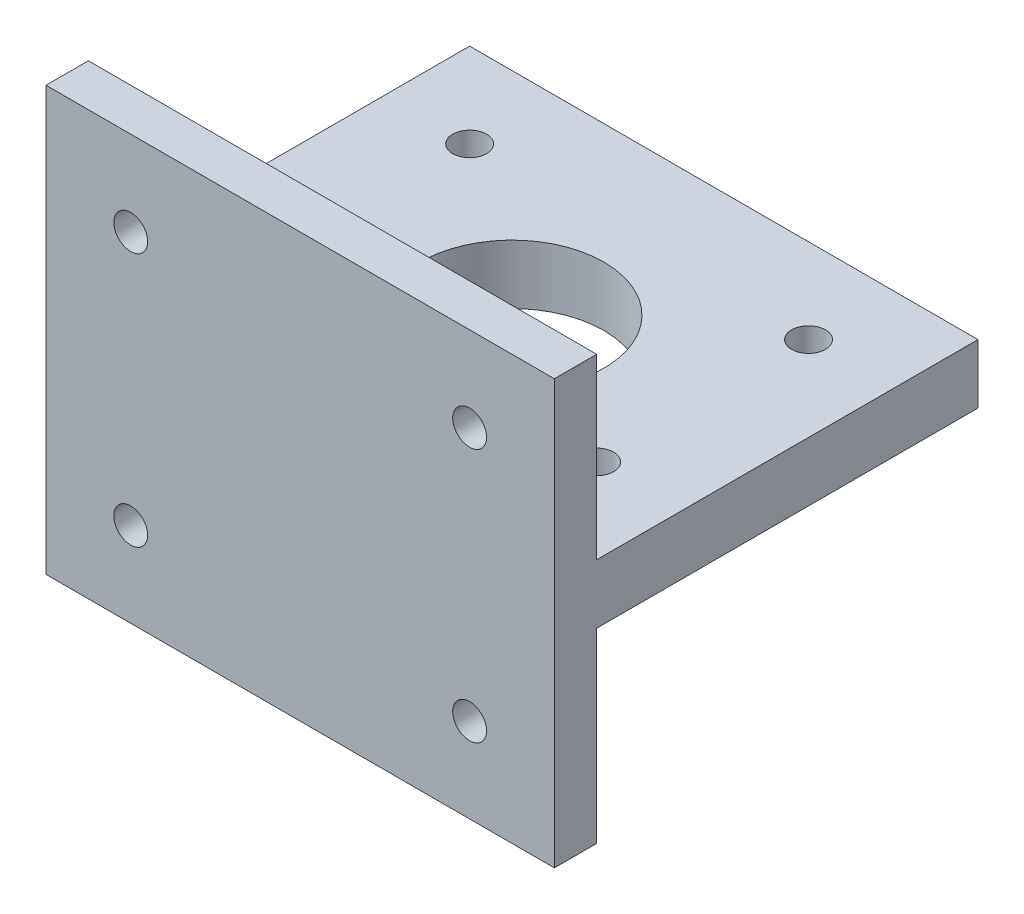
ISO-10303-21;
HEADER;
FILE_DESCRIPTION(('STEP AP214'),'2;1');
FILE_NAME('part.step','',(''),(''),'','','');
FILE_SCHEMA(('AUTOMOTIVE_DESIGN { 1 0 10303 214 1 1 1 1 }'));
ENDSEC;
DATA;
#1=APPLICATION_CONTEXT('core data for automotive mechanical design processes');
#2=APPLICATION_PROTOCOL_DEFINITION('international standard','automotive_design',2000,#1);
#3=PRODUCT_CONTEXT('',#1,'mechanical');
#4=PRODUCT('Part','Part','',(#3));
#5=PRODUCT_RELATED_PRODUCT_CATEGORY('part','',(#4));
#6=PRODUCT_DEFINITION_FORMATION('','',#4);
#7=PRODUCT_DEFINITION_CONTEXT('part definition',#1,'design');
#8=PRODUCT_DEFINITION('design','',#6,#7);
#9=PRODUCT_DEFINITION_SHAPE('','',#8);
#10=(LENGTH_UNIT() NAMED_UNIT(*) SI_UNIT(.MILLI.,.METRE.));
#11=(NAMED_UNIT(*) PLANE_ANGLE_UNIT() SI_UNIT($,.RADIAN.));
#12=(NAMED_UNIT(*) SI_UNIT($,.STERADIAN.) SOLID_ANGLE_UNIT());
#13=UNCERTAINTY_MEASURE_WITH_UNIT(LENGTH_MEASURE(1.E-05),#10,'distance_accuracy_value','');
#14=(GEOMETRIC_REPRESENTATION_CONTEXT(3) GLOBAL_UNCERTAINTY_ASSIGNED_CONTEXT((#13)) GLOBAL_UNIT_ASSIGNED_CONTEXT((#10,
#11,#12)) REPRESENTATION_CONTEXT('',''));
#15=CARTESIAN_POINT('',(0.,0.,0.));
#16=DIRECTION('',(0.,0.,1.));
#17=DIRECTION('',(1.,0.,0.));
#18=AXIS2_PLACEMENT_3D('',#15,#16,#17);
#19=CARTESIAN_POINT('',(0.,7.,0.));
#20=DIRECTION('',(0.,-1.,0.));
#21=DIRECTION('',(0.,0.,-1.));
#22=AXIS2_PLACEMENT_3D('',#19,#20,#21);
#23=PLANE('',#22);
#24=CARTESIAN_POINT('',(-20.,7.,-15.));
#25=DIRECTION('',(0.,-1.,0.));
#26=DIRECTION('',(0.,0.,-1.));
#27=AXIS2_PLACEMENT_3D('',#24,#25,#26);
#28=CIRCLE('',#27,2.);
#29=CARTESIAN_POINT('',(-20.,7.,-17.));
#30=VERTEX_POINT('',#29);
#31=EDGE_CURVE('E293',#30,#30,#28,.T.);
#32=ORIENTED_EDGE('',*,*,#31,.T.);
#33=EDGE_LOOP('',(#32));
#34=FACE_BOUND('',#33,.T.);
#35=CARTESIAN_POINT('',(-20.,7.,10.));
#36=DIRECTION('',(0.,-1.,0.));
#37=DIRECTION('',(0.,0.,-1.));
#38=AXIS2_PLACEMENT_3D('',#35,#36,#37);
#39=CIRCLE('',#38,2.);
#40=CARTESIAN_POINT('',(-20.,7.,8.));
#41=VERTEX_POINT('',#40);
#42=EDGE_CURVE('E290',#41,#41,#39,.T.);
#43=ORIENTED_EDGE('',*,*,#42,.T.);
#44=EDGE_LOOP('',(#43));
#45=FACE_BOUND('',#44,.T.);
#46=CARTESIAN_POINT('',(0.,7.,0.));
#47=DIRECTION('',(0.,1.,0.));
#48=DIRECTION('',(0.,0.,1.));
#49=AXIS2_PLACEMENT_3D('',#46,#47,#48);
#50=CIRCLE('',#49,10.85);
#51=CARTESIAN_POINT('',(0.,7.,10.85));
#52=VERTEX_POINT('',#51);
#53=EDGE_CURVE('E158',#52,#52,#50,.T.);
#54=ORIENTED_EDGE('',*,*,#53,.F.);
#55=EDGE_LOOP('',(#54));
#56=FACE_BOUND('',#55,.T.);
#57=DIRECTION('',(-1.,0.,0.));
#58=VECTOR('',#57,1.);
#59=CARTESIAN_POINT('',(0.,7.,20.));
#60=LINE('',#59,#58);
#61=CARTESIAN_POINT('',(30.,7.,20.));
#62=VERTEX_POINT('',#61);
#63=CARTESIAN_POINT('',(-30.,7.,20.));
#64=VERTEX_POINT('',#63);
#65=EDGE_CURVE('E58',#62,#64,#60,.T.);
#66=ORIENTED_EDGE('',*,*,#65,.F.);
#67=DIRECTION('',(0.,0.,-1.));
#68=VECTOR('',#67,1.);
#69=CARTESIAN_POINT('',(30.,7.,25.));
#70=LINE('',#69,#68);
#71=CARTESIAN_POINT('',(30.,7.,-25.));
#72=VERTEX_POINT('',#71);
#73=EDGE_CURVE('E164',#62,#72,#70,.T.);
#74=ORIENTED_EDGE('',*,*,#73,.T.);
#75=DIRECTION('',(-1.,0.,0.));
#76=VECTOR('',#75,1.);
#77=CARTESIAN_POINT('',(-30.,7.,-25.));
#78=LINE('',#77,#76);
#79=CARTESIAN_POINT('',(-30.,7.,-25.));
#80=VERTEX_POINT('',#79);
#81=EDGE_CURVE('E166',#72,#80,#78,.T.);
#82=ORIENTED_EDGE('',*,*,#81,.T.);
#83=DIRECTION('',(0.,0.,1.));
#84=VECTOR('',#83,1.);
#85=CARTESIAN_POINT('',(-30.,7.,25.));
#86=LINE('',#85,#84);
#87=EDGE_CURVE('E169',#80,#64,#86,.T.);
#88=ORIENTED_EDGE('',*,*,#87,.T.);
#89=EDGE_LOOP('',(#66,#74,#82,#88));
#90=FACE_BOUND('',#89,.T.);
#91=CARTESIAN_POINT('',(19.9999999999999,7.,10.));
#92=DIRECTION('',(0.,-1.,0.));
#93=DIRECTION('',(0.,0.,-1.));
#94=AXIS2_PLACEMENT_3D('',#91,#92,#93);
#95=CIRCLE('',#94,2.);
#96=CARTESIAN_POINT('',(19.9999999999999,7.,8.));
#97=VERTEX_POINT('',#96);
#98=EDGE_CURVE('E287',#97,#97,#95,.F.);
#99=ORIENTED_EDGE('',*,*,#98,.F.);
#100=EDGE_LOOP('',(#99));
#101=FACE_BOUND('',#100,.T.);
#102=CARTESIAN_POINT('',(20.0000000000001,7.,-14.9999999999998));
#103=DIRECTION('',(0.,-1.,0.));
#104=DIRECTION('',(0.,0.,-1.));
#105=AXIS2_PLACEMENT_3D('',#102,#103,#104);
#106=CIRCLE('',#105,2.);
#107=CARTESIAN_POINT('',(20.0000000000001,7.,-16.9999999999998));
#108=VERTEX_POINT('',#107);
#109=EDGE_CURVE('E289',#108,#108,#106,.F.);
#110=ORIENTED_EDGE('',*,*,#109,.F.);
#111=EDGE_LOOP('',(#110));
#112=FACE_BOUND('',#111,.T.);
#113=ADVANCED_FACE('F41',(#34,#45,#56,#90,#101,#112),#23,.F.);
#114=CARTESIAN_POINT('',(0.,0.,0.));
#115=DIRECTION('',(0.,-1.,0.));
#116=DIRECTION('',(0.,0.,-1.));
#117=AXIS2_PLACEMENT_3D('',#114,#115,#116);
#118=PLANE('',#117);
#119=CARTESIAN_POINT('',(-20.,0.,-15.));
#120=DIRECTION('',(0.,-1.,0.));
#121=DIRECTION('',(0.,0.,-1.));
#122=AXIS2_PLACEMENT_3D('',#119,#120,#121);
#123=CIRCLE('',#122,2.);
#124=CARTESIAN_POINT('',(-20.,0.,-17.));
#125=VERTEX_POINT('',#124);
#126=EDGE_CURVE('E330',#125,#125,#123,.T.);
#127=ORIENTED_EDGE('',*,*,#126,.F.);
#128=EDGE_LOOP('',(#127));
#129=FACE_BOUND('',#128,.T.);
#130=CARTESIAN_POINT('',(19.9999999999999,0.,10.));
#131=DIRECTION('',(0.,-1.,0.));
#132=DIRECTION('',(0.,0.,-1.));
#133=AXIS2_PLACEMENT_3D('',#130,#131,#132);
#134=CIRCLE('',#133,2.);
#135=CARTESIAN_POINT('',(19.9999999999999,0.,8.));
#136=VERTEX_POINT('',#135);
#137=EDGE_CURVE('E284',#136,#136,#134,.F.);
#138=ORIENTED_EDGE('',*,*,#137,.T.);
#139=EDGE_LOOP('',(#138));
#140=FACE_BOUND('',#139,.T.);
#141=CARTESIAN_POINT('',(-20.,0.,10.));
#142=DIRECTION('',(0.,-1.,0.));
#143=DIRECTION('',(0.,0.,-1.));
#144=AXIS2_PLACEMENT_3D('',#141,#142,#143);
#145=CIRCLE('',#144,2.);
#146=CARTESIAN_POINT('',(-20.,0.,8.));
#147=VERTEX_POINT('',#146);
#148=EDGE_CURVE('E296',#147,#147,#145,.T.);
#149=ORIENTED_EDGE('',*,*,#148,.F.);
#150=EDGE_LOOP('',(#149));
#151=FACE_BOUND('',#150,.T.);
#152=CARTESIAN_POINT('',(0.,0.,0.));
#153=DIRECTION('',(0.,1.,0.));
#154=DIRECTION('',(0.,0.,1.));
#155=AXIS2_PLACEMENT_3D('',#152,#153,#154);
#156=CIRCLE('',#155,10.85);
#157=CARTESIAN_POINT('',(0.,0.,10.85));
#158=VERTEX_POINT('',#157);
#159=EDGE_CURVE('E157',#158,#158,#156,.T.);
#160=ORIENTED_EDGE('',*,*,#159,.T.);
#161=EDGE_LOOP('',(#160));
#162=FACE_BOUND('',#161,.T.);
#163=DIRECTION('',(0.,0.,-1.));
#164=VECTOR('',#163,1.);
#165=CARTESIAN_POINT('',(30.,0.,25.));
#166=LINE('',#165,#164);
#167=CARTESIAN_POINT('',(30.,0.,20.));
#168=VERTEX_POINT('',#167);
#169=CARTESIAN_POINT('',(30.,0.,-25.));
#170=VERTEX_POINT('',#169);
#171=EDGE_CURVE('E161',#168,#170,#166,.T.);
#172=ORIENTED_EDGE('',*,*,#171,.F.);
#173=DIRECTION('',(-1.,0.,0.));
#174=VECTOR('',#173,1.);
#175=CARTESIAN_POINT('',(0.,0.,20.));
#176=LINE('',#175,#174);
#177=CARTESIAN_POINT('',(-30.,0.,20.));
#178=VERTEX_POINT('',#177);
#179=EDGE_CURVE('E154',#168,#178,#176,.T.);
#180=ORIENTED_EDGE('',*,*,#179,.T.);
#181=DIRECTION('',(0.,0.,1.));
#182=VECTOR('',#181,1.);
#183=CARTESIAN_POINT('',(-30.,0.,25.));
#184=LINE('',#183,#182);
#185=CARTESIAN_POINT('',(-30.,0.,-25.));
#186=VERTEX_POINT('',#185);
#187=EDGE_CURVE('E167',#186,#178,#184,.T.);
#188=ORIENTED_EDGE('',*,*,#187,.F.);
#189=DIRECTION('',(-1.,0.,0.));
#190=VECTOR('',#189,1.);
#191=CARTESIAN_POINT('',(-30.,0.,-25.));
#192=LINE('',#191,#190);
#193=EDGE_CURVE('E172',#170,#186,#192,.T.);
#194=ORIENTED_EDGE('',*,*,#193,.F.);
#195=EDGE_LOOP('',(#172,#180,#188,#194));
#196=FACE_BOUND('',#195,.T.);
#197=CARTESIAN_POINT('',(20.0000000000001,0.,-14.9999999999998));
#198=DIRECTION('',(0.,-1.,0.));
#199=DIRECTION('',(0.,0.,-1.));
#200=AXIS2_PLACEMENT_3D('',#197,#198,#199);
#201=CIRCLE('',#200,2.);
#202=CARTESIAN_POINT('',(20.0000000000001,0.,-16.9999999999998));
#203=VERTEX_POINT('',#202);
#204=EDGE_CURVE('E333',#203,#203,#201,.F.);
#205=ORIENTED_EDGE('',*,*,#204,.T.);
#206=EDGE_LOOP('',(#205));
#207=FACE_BOUND('',#206,.T.);
#208=ADVANCED_FACE('F202',(#129,#140,#151,#162,#196,#207),#118,.T.);
#209=CARTESIAN_POINT('',(-30.,7.,25.));
#210=DIRECTION('',(0.,0.,-1.));
#211=DIRECTION('',(-1.,0.,0.));
#212=AXIS2_PLACEMENT_3D('',#209,#210,#211);
#213=PLANE('',#212);
#214=CARTESIAN_POINT('',(20.0000000000001,-11.9999999999998,25.));
#215=DIRECTION('',(0.,0.,1.));
#216=DIRECTION('',(1.,0.,0.));
#217=AXIS2_PLACEMENT_3D('',#214,#215,#216);
#218=CIRCLE('',#217,2.);
#219=CARTESIAN_POINT('',(22.0000000000001,-11.9999999999998,25.));
#220=VERTEX_POINT('',#219);
#221=EDGE_CURVE('E301',#220,#220,#218,.T.);
#222=ORIENTED_EDGE('',*,*,#221,.F.);
#223=EDGE_LOOP('',(#222));
#224=FACE_BOUND('',#223,.T.);
#225=CARTESIAN_POINT('',(-20.,18.,25.));
#226=DIRECTION('',(0.,0.,1.));
#227=DIRECTION('',(1.,0.,0.));
#228=AXIS2_PLACEMENT_3D('',#225,#226,#227);
#229=CIRCLE('',#228,2.);
#230=CARTESIAN_POINT('',(-18.,18.,25.));
#231=VERTEX_POINT('',#230);
#232=EDGE_CURVE('E138',#231,#231,#229,.T.);
#233=ORIENTED_EDGE('',*,*,#232,.F.);
#234=EDGE_LOOP('',(#233));
#235=FACE_BOUND('',#234,.T.);
#236=DIRECTION('',(0.,-1.,0.));
#237=VECTOR('',#236,1.);
#238=CARTESIAN_POINT('',(-30.,7.,25.));
#239=LINE('',#238,#237);
#240=CARTESIAN_POINT('',(-30.,28.,25.));
#241=VERTEX_POINT('',#240);
#242=CARTESIAN_POINT('',(-30.,-22.,25.));
#243=VERTEX_POINT('',#242);
#244=EDGE_CURVE('E108',#241,#243,#239,.T.);
#245=ORIENTED_EDGE('',*,*,#244,.T.);
#246=DIRECTION('',(1.,0.,0.));
#247=VECTOR('',#246,1.);
#248=CARTESIAN_POINT('',(-30.,-22.,25.));
#249=LINE('',#248,#247);
#250=CARTESIAN_POINT('',(30.,-22.,25.));
#251=VERTEX_POINT('',#250);
#252=EDGE_CURVE('E144',#243,#251,#249,.T.);
#253=ORIENTED_EDGE('',*,*,#252,.T.);
#254=DIRECTION('',(0.,-1.,0.));
#255=VECTOR('',#254,1.);
#256=CARTESIAN_POINT('',(30.,7.,25.));
#257=LINE('',#256,#255);
#258=CARTESIAN_POINT('',(30.,28.,25.));
#259=VERTEX_POINT('',#258);
#260=EDGE_CURVE('E119',#259,#251,#257,.T.);
#261=ORIENTED_EDGE('',*,*,#260,.F.);
#262=DIRECTION('',(1.,0.,0.));
#263=VECTOR('',#262,1.);
#264=CARTESIAN_POINT('',(-30.,28.,25.));
#265=LINE('',#264,#263);
#266=EDGE_CURVE('E122',#241,#259,#265,.T.);
#267=ORIENTED_EDGE('',*,*,#266,.F.);
#268=EDGE_LOOP('',(#245,#253,#261,#267));
#269=FACE_BOUND('',#268,.T.);
#270=CARTESIAN_POINT('',(-20.,-12.,25.));
#271=DIRECTION('',(0.,0.,1.));
#272=DIRECTION('',(1.,0.,0.));
#273=AXIS2_PLACEMENT_3D('',#270,#271,#272);
#274=CIRCLE('',#273,2.);
#275=CARTESIAN_POINT('',(-18.,-12.,25.));
#276=VERTEX_POINT('',#275);
#277=EDGE_CURVE('E304',#276,#276,#274,.F.);
#278=ORIENTED_EDGE('',*,*,#277,.T.);
#279=EDGE_LOOP('',(#278));
#280=FACE_BOUND('',#279,.T.);
#281=CARTESIAN_POINT('',(19.9999999999999,18.,25.));
#282=DIRECTION('',(0.,0.,1.));
#283=DIRECTION('',(1.,0.,0.));
#284=AXIS2_PLACEMENT_3D('',#281,#282,#283);
#285=CIRCLE('',#284,2.00000000000001);
#286=CARTESIAN_POINT('',(21.9999999999999,18.,25.));
#287=VERTEX_POINT('',#286);
#288=EDGE_CURVE('E305',#287,#287,#285,.F.);
#289=ORIENTED_EDGE('',*,*,#288,.T.);
#290=EDGE_LOOP('',(#289));
#291=FACE_BOUND('',#290,.T.);
#292=ADVANCED_FACE('F123',(#224,#235,#269,#280,#291),#213,.F.);
#293=CARTESIAN_POINT('',(-30.,28.,20.));
#294=DIRECTION('',(0.,0.,1.));
#295=DIRECTION('',(1.,0.,0.));
#296=AXIS2_PLACEMENT_3D('',#293,#294,#295);
#297=PLANE('',#296);
#298=CARTESIAN_POINT('',(20.0000000000001,-11.9999999999998,20.));
#299=DIRECTION('',(0.,0.,1.));
#300=DIRECTION('',(1.,0.,0.));
#301=AXIS2_PLACEMENT_3D('',#298,#299,#300);
#302=CIRCLE('',#301,2.);
#303=CARTESIAN_POINT('',(22.0000000000001,-11.9999999999998,20.));
#304=VERTEX_POINT('',#303);
#305=EDGE_CURVE('E184',#304,#304,#302,.T.);
#306=ORIENTED_EDGE('',*,*,#305,.T.);
#307=EDGE_LOOP('',(#306));
#308=FACE_BOUND('',#307,.T.);
#309=ORIENTED_EDGE('',*,*,#179,.F.);
#310=DIRECTION('',(0.,-1.,0.));
#311=VECTOR('',#310,1.);
#312=CARTESIAN_POINT('',(30.,28.,20.));
#313=LINE('',#312,#311);
#314=CARTESIAN_POINT('',(30.,-22.,20.));
#315=VERTEX_POINT('',#314);
#316=EDGE_CURVE('E150',#168,#315,#313,.T.);
#317=ORIENTED_EDGE('',*,*,#316,.T.);
#318=DIRECTION('',(-1.,0.,0.));
#319=VECTOR('',#318,1.);
#320=CARTESIAN_POINT('',(-30.,-22.,20.));
#321=LINE('',#320,#319);
#322=CARTESIAN_POINT('',(-30.,-22.,20.));
#323=VERTEX_POINT('',#322);
#324=EDGE_CURVE('E133',#315,#323,#321,.T.);
#325=ORIENTED_EDGE('',*,*,#324,.T.);
#326=DIRECTION('',(0.,-1.,0.));
#327=VECTOR('',#326,1.);
#328=CARTESIAN_POINT('',(-30.,28.,20.));
#329=LINE('',#328,#327);
#330=EDGE_CURVE('E66',#178,#323,#329,.T.);
#331=ORIENTED_EDGE('',*,*,#330,.F.);
#332=EDGE_LOOP('',(#309,#317,#325,#331));
#333=FACE_BOUND('',#332,.T.);
#334=CARTESIAN_POINT('',(-20.,-12.,20.));
#335=DIRECTION('',(0.,0.,1.));
#336=DIRECTION('',(1.,0.,0.));
#337=AXIS2_PLACEMENT_3D('',#334,#335,#336);
#338=CIRCLE('',#337,2.);
#339=CARTESIAN_POINT('',(-18.,-12.,20.));
#340=VERTEX_POINT('',#339);
#341=EDGE_CURVE('E45',#340,#340,#338,.F.);
#342=ORIENTED_EDGE('',*,*,#341,.F.);
#343=EDGE_LOOP('',(#342));
#344=FACE_BOUND('',#343,.T.);
#345=ADVANCED_FACE('F193',(#308,#333,#344),#297,.F.);
#346=CARTESIAN_POINT('',(-20.,18.,20.));
#347=DIRECTION('',(0.,0.,1.));
#348=DIRECTION('',(1.,0.,0.));
#349=AXIS2_PLACEMENT_3D('',#346,#347,#348);
#350=CIRCLE('',#349,2.);
#351=CARTESIAN_POINT('',(-18.,18.,20.));
#352=VERTEX_POINT('',#351);
#353=EDGE_CURVE('E179',#352,#352,#350,.T.);
#354=ORIENTED_EDGE('',*,*,#353,.T.);
#355=EDGE_LOOP('',(#354));
#356=FACE_BOUND('',#355,.T.);
#357=CARTESIAN_POINT('',(30.,28.,20.));
#358=VERTEX_POINT('',#357);
#359=EDGE_CURVE('E151',#358,#62,#313,.T.);
#360=ORIENTED_EDGE('',*,*,#359,.T.);
#361=ORIENTED_EDGE('',*,*,#65,.T.);
#362=CARTESIAN_POINT('',(-30.,28.,20.));
#363=VERTEX_POINT('',#362);
#364=EDGE_CURVE('E148',#363,#64,#329,.T.);
#365=ORIENTED_EDGE('',*,*,#364,.F.);
#366=DIRECTION('',(-1.,0.,0.));
#367=VECTOR('',#366,1.);
#368=CARTESIAN_POINT('',(-30.,28.,20.));
#369=LINE('',#368,#367);
#370=EDGE_CURVE('E131',#358,#363,#369,.T.);
#371=ORIENTED_EDGE('',*,*,#370,.F.);
#372=EDGE_LOOP('',(#360,#361,#365,#371));
#373=FACE_BOUND('',#372,.T.);
#374=CARTESIAN_POINT('',(19.9999999999999,18.,20.));
#375=DIRECTION('',(0.,0.,1.));
#376=DIRECTION('',(1.,0.,0.));
#377=AXIS2_PLACEMENT_3D('',#374,#375,#376);
#378=CIRCLE('',#377,2.00000000000001);
#379=CARTESIAN_POINT('',(21.9999999999999,18.,20.));
#380=VERTEX_POINT('',#379);
#381=EDGE_CURVE('E182',#380,#380,#378,.F.);
#382=ORIENTED_EDGE('',*,*,#381,.F.);
#383=EDGE_LOOP('',(#382));
#384=FACE_BOUND('',#383,.T.);
#385=ADVANCED_FACE('F195',(#356,#373,#384),#297,.F.);
#386=CARTESIAN_POINT('',(30.,7.,25.));
#387=DIRECTION('',(-1.,0.,0.));
#388=DIRECTION('',(0.,0.,1.));
#389=AXIS2_PLACEMENT_3D('',#386,#387,#388);
#390=PLANE('',#389);
#391=ORIENTED_EDGE('',*,*,#260,.T.);
#392=DIRECTION('',(0.,0.,-1.));
#393=VECTOR('',#392,1.);
#394=CARTESIAN_POINT('',(30.,-22.,25.));
#395=LINE('',#394,#393);
#396=EDGE_CURVE('E135',#251,#315,#395,.T.);
#397=ORIENTED_EDGE('',*,*,#396,.T.);
#398=ORIENTED_EDGE('',*,*,#316,.F.);
#399=ORIENTED_EDGE('',*,*,#171,.T.);
#400=DIRECTION('',(0.,-1.,0.));
#401=VECTOR('',#400,1.);
#402=CARTESIAN_POINT('',(30.,7.,-25.));
#403=LINE('',#402,#401);
#404=EDGE_CURVE('E11',#72,#170,#403,.T.);
#405=ORIENTED_EDGE('',*,*,#404,.F.);
#406=ORIENTED_EDGE('',*,*,#73,.F.);
#407=ORIENTED_EDGE('',*,*,#359,.F.);
#408=DIRECTION('',(0.,0.,-1.));
#409=VECTOR('',#408,1.);
#410=CARTESIAN_POINT('',(30.,28.,25.));
#411=LINE('',#410,#409);
#412=EDGE_CURVE('E127',#259,#358,#411,.T.);
#413=ORIENTED_EDGE('',*,*,#412,.F.);
#414=EDGE_LOOP('',(#391,#397,#398,#399,#405,#406,#407,#413));
#415=FACE_BOUND('',#414,.T.);
#416=ADVANCED_FACE('F43',(#415),#390,.F.);
#417=CARTESIAN_POINT('',(-30.,7.,-25.));
#418=DIRECTION('',(0.,0.,1.));
#419=DIRECTION('',(1.,0.,0.));
#420=AXIS2_PLACEMENT_3D('',#417,#418,#419);
#421=PLANE('',#420);
#422=ORIENTED_EDGE('',*,*,#193,.T.);
#423=DIRECTION('',(0.,-1.,0.));
#424=VECTOR('',#423,1.);
#425=CARTESIAN_POINT('',(-30.,7.,-25.));
#426=LINE('',#425,#424);
#427=EDGE_CURVE('E50',#80,#186,#426,.T.);
#428=ORIENTED_EDGE('',*,*,#427,.F.);
#429=ORIENTED_EDGE('',*,*,#81,.F.);
#430=ORIENTED_EDGE('',*,*,#404,.T.);
#431=EDGE_LOOP('',(#422,#428,#429,#430));
#432=FACE_BOUND('',#431,.T.);
#433=ADVANCED_FACE('F221',(#432),#421,.F.);
#434=CARTESIAN_POINT('',(-30.,7.,25.));
#435=DIRECTION('',(1.,0.,0.));
#436=DIRECTION('',(0.,0.,-1.));
#437=AXIS2_PLACEMENT_3D('',#434,#435,#436);
#438=PLANE('',#437);
#439=ORIENTED_EDGE('',*,*,#244,.F.);
#440=DIRECTION('',(0.,0.,1.));
#441=VECTOR('',#440,1.);
#442=CARTESIAN_POINT('',(-30.,28.,25.));
#443=LINE('',#442,#441);
#444=EDGE_CURVE('E113',#363,#241,#443,.T.);
#445=ORIENTED_EDGE('',*,*,#444,.F.);
#446=ORIENTED_EDGE('',*,*,#364,.T.);
#447=ORIENTED_EDGE('',*,*,#87,.F.);
#448=ORIENTED_EDGE('',*,*,#427,.T.);
#449=ORIENTED_EDGE('',*,*,#187,.T.);
#450=ORIENTED_EDGE('',*,*,#330,.T.);
#451=DIRECTION('',(0.,0.,1.));
#452=VECTOR('',#451,1.);
#453=CARTESIAN_POINT('',(-30.,-22.,25.));
#454=LINE('',#453,#452);
#455=EDGE_CURVE('E115',#323,#243,#454,.T.);
#456=ORIENTED_EDGE('',*,*,#455,.T.);
#457=EDGE_LOOP('',(#439,#445,#446,#447,#448,#449,#450,#456));
#458=FACE_BOUND('',#457,.T.);
#459=ADVANCED_FACE('F110',(#458),#438,.F.);
#460=CARTESIAN_POINT('',(0.,7.,0.));
#461=DIRECTION('',(0.,-1.,0.));
#462=DIRECTION('',(0.,0.,-1.));
#463=AXIS2_PLACEMENT_3D('',#460,#461,#462);
#464=CYLINDRICAL_SURFACE('',#463,10.85);
#465=ORIENTED_EDGE('',*,*,#53,.T.);
#466=EDGE_LOOP('',(#465));
#467=FACE_BOUND('',#466,.T.);
#468=ORIENTED_EDGE('',*,*,#159,.F.);
#469=EDGE_LOOP('',(#468));
#470=FACE_BOUND('',#469,.T.);
#471=ADVANCED_FACE('F218',(#467,#470),#464,.F.);
#472=CARTESIAN_POINT('',(0.,-22.,0.));
#473=DIRECTION('',(0.,-1.,0.));
#474=DIRECTION('',(0.,0.,-1.));
#475=AXIS2_PLACEMENT_3D('',#472,#473,#474);
#476=PLANE('',#475);
#477=ORIENTED_EDGE('',*,*,#455,.F.);
#478=ORIENTED_EDGE('',*,*,#324,.F.);
#479=ORIENTED_EDGE('',*,*,#396,.F.);
#480=ORIENTED_EDGE('',*,*,#252,.F.);
#481=EDGE_LOOP('',(#477,#478,#479,#480));
#482=FACE_BOUND('',#481,.T.);
#483=ADVANCED_FACE('F242',(#482),#476,.T.);
#484=CARTESIAN_POINT('',(0.,28.,0.));
#485=DIRECTION('',(0.,-1.,0.));
#486=DIRECTION('',(0.,0.,-1.));
#487=AXIS2_PLACEMENT_3D('',#484,#485,#486);
#488=PLANE('',#487);
#489=ORIENTED_EDGE('',*,*,#444,.T.);
#490=ORIENTED_EDGE('',*,*,#266,.T.);
#491=ORIENTED_EDGE('',*,*,#412,.T.);
#492=ORIENTED_EDGE('',*,*,#370,.T.);
#493=EDGE_LOOP('',(#489,#490,#491,#492));
#494=FACE_BOUND('',#493,.T.);
#495=ADVANCED_FACE('F129',(#494),#488,.F.);
#496=CARTESIAN_POINT('',(-20.,18.,-25.));
#497=DIRECTION('',(0.,0.,1.));
#498=DIRECTION('',(1.,0.,0.));
#499=AXIS2_PLACEMENT_3D('',#496,#497,#498);
#500=CYLINDRICAL_SURFACE('',#499,2.);
#501=ORIENTED_EDGE('',*,*,#232,.T.);
#502=EDGE_LOOP('',(#501));
#503=FACE_BOUND('',#502,.T.);
#504=ORIENTED_EDGE('',*,*,#353,.F.);
#505=EDGE_LOOP('',(#504));
#506=FACE_BOUND('',#505,.T.);
#507=ADVANCED_FACE('F247',(#503,#506),#500,.F.);
#508=CARTESIAN_POINT('',(19.9999999999999,18.,-25.));
#509=DIRECTION('',(0.,0.,1.));
#510=DIRECTION('',(1.,0.,0.));
#511=AXIS2_PLACEMENT_3D('',#508,#509,#510);
#512=CYLINDRICAL_SURFACE('',#511,2.00000000000001);
#513=ORIENTED_EDGE('',*,*,#288,.F.);
#514=EDGE_LOOP('',(#513));
#515=FACE_BOUND('',#514,.T.);
#516=ORIENTED_EDGE('',*,*,#381,.T.);
#517=EDGE_LOOP('',(#516));
#518=FACE_BOUND('',#517,.T.);
#519=ADVANCED_FACE('F253',(#515,#518),#512,.F.);
#520=CARTESIAN_POINT('',(20.0000000000001,-11.9999999999998,-25.));
#521=DIRECTION('',(0.,0.,1.));
#522=DIRECTION('',(1.,0.,0.));
#523=AXIS2_PLACEMENT_3D('',#520,#521,#522);
#524=CYLINDRICAL_SURFACE('',#523,2.);
#525=ORIENTED_EDGE('',*,*,#221,.T.);
#526=EDGE_LOOP('',(#525));
#527=FACE_BOUND('',#526,.T.);
#528=ORIENTED_EDGE('',*,*,#305,.F.);
#529=EDGE_LOOP('',(#528));
#530=FACE_BOUND('',#529,.T.);
#531=ADVANCED_FACE('F257',(#527,#530),#524,.F.);
#532=CARTESIAN_POINT('',(-20.,-12.,-25.));
#533=DIRECTION('',(0.,0.,1.));
#534=DIRECTION('',(1.,0.,0.));
#535=AXIS2_PLACEMENT_3D('',#532,#533,#534);
#536=CYLINDRICAL_SURFACE('',#535,2.);
#537=ORIENTED_EDGE('',*,*,#277,.F.);
#538=EDGE_LOOP('',(#537));
#539=FACE_BOUND('',#538,.T.);
#540=ORIENTED_EDGE('',*,*,#341,.T.);
#541=EDGE_LOOP('',(#540));
#542=FACE_BOUND('',#541,.T.);
#543=ADVANCED_FACE('F191',(#539,#542),#536,.F.);
#544=CARTESIAN_POINT('',(-20.,50.,10.));
#545=DIRECTION('',(0.,-1.,0.));
#546=DIRECTION('',(0.,0.,-1.));
#547=AXIS2_PLACEMENT_3D('',#544,#545,#546);
#548=CYLINDRICAL_SURFACE('',#547,2.);
#549=ORIENTED_EDGE('',*,*,#148,.T.);
#550=EDGE_LOOP('',(#549));
#551=FACE_BOUND('',#550,.T.);
#552=ORIENTED_EDGE('',*,*,#42,.F.);
#553=EDGE_LOOP('',(#552));
#554=FACE_BOUND('',#553,.T.);
#555=ADVANCED_FACE('F256',(#551,#554),#548,.F.);
#556=CARTESIAN_POINT('',(19.9999999999999,50.,10.));
#557=DIRECTION('',(0.,-1.,0.));
#558=DIRECTION('',(0.,0.,-1.));
#559=AXIS2_PLACEMENT_3D('',#556,#557,#558);
#560=CYLINDRICAL_SURFACE('',#559,2.);
#561=ORIENTED_EDGE('',*,*,#137,.F.);
#562=EDGE_LOOP('',(#561));
#563=FACE_BOUND('',#562,.T.);
#564=ORIENTED_EDGE('',*,*,#98,.T.);
#565=EDGE_LOOP('',(#564));
#566=FACE_BOUND('',#565,.T.);
#567=ADVANCED_FACE('F267',(#563,#566),#560,.F.);
#568=CARTESIAN_POINT('',(20.0000000000001,50.,-14.9999999999998));
#569=DIRECTION('',(0.,-1.,0.));
#570=DIRECTION('',(0.,0.,-1.));
#571=AXIS2_PLACEMENT_3D('',#568,#569,#570);
#572=CYLINDRICAL_SURFACE('',#571,2.);
#573=ORIENTED_EDGE('',*,*,#204,.F.);
#574=EDGE_LOOP('',(#573));
#575=FACE_BOUND('',#574,.T.);
#576=ORIENTED_EDGE('',*,*,#109,.T.);
#577=EDGE_LOOP('',(#576));
#578=FACE_BOUND('',#577,.T.);
#579=ADVANCED_FACE('F272',(#575,#578),#572,.F.);
#580=CARTESIAN_POINT('',(-20.,50.,-15.));
#581=DIRECTION('',(0.,-1.,0.));
#582=DIRECTION('',(0.,0.,-1.));
#583=AXIS2_PLACEMENT_3D('',#580,#581,#582);
#584=CYLINDRICAL_SURFACE('',#583,2.);
#585=ORIENTED_EDGE('',*,*,#126,.T.);
#586=EDGE_LOOP('',(#585));
#587=FACE_BOUND('',#586,.T.);
#588=ORIENTED_EDGE('',*,*,#31,.F.);
#589=EDGE_LOOP('',(#588));
#590=FACE_BOUND('',#589,.T.);
#591=ADVANCED_FACE('F269',(#587,#590),#584,.F.);
#592=CLOSED_SHELL('',(#113,#208,#292,#345,#385,#416,#433,#459,#471,#483,#495,#507,#519,#531,
#543,#555,#567,#579,#591));
#593=MANIFOLD_SOLID_BREP('B2',#592);
#594=ADVANCED_BREP_SHAPE_REPRESENTATION('',(#18,#593),#14);
#595=SHAPE_DEFINITION_REPRESENTATION(#9,#594);
ENDSEC;
END-ISO-10303-21;
